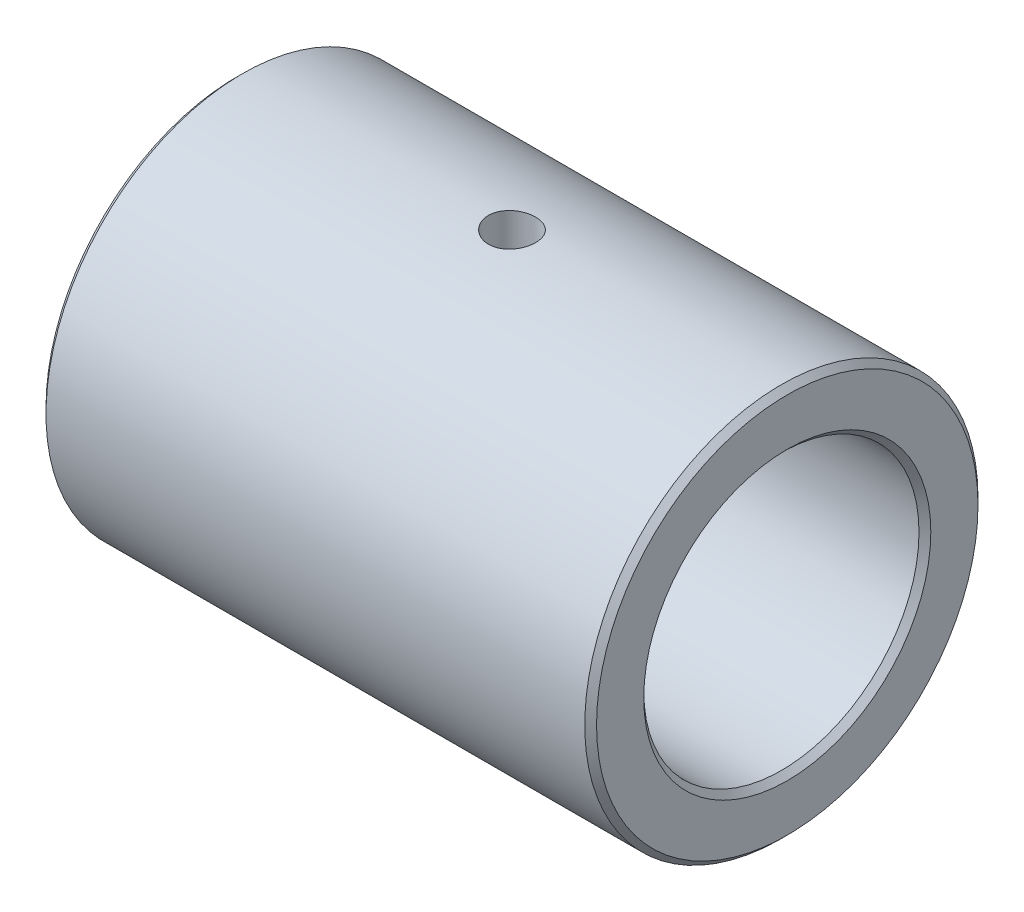
ISO-10303-21;
HEADER;
FILE_DESCRIPTION(('STEP AP214'),'2;1');
FILE_NAME('part.step','',(''),(''),'','','');
FILE_SCHEMA(('AUTOMOTIVE_DESIGN { 1 0 10303 214 1 1 1 1 }'));
ENDSEC;
DATA;
#1=APPLICATION_CONTEXT('core data for automotive mechanical design processes');
#2=APPLICATION_PROTOCOL_DEFINITION('international standard','automotive_design',2000,#1);
#3=PRODUCT_CONTEXT('',#1,'mechanical');
#4=PRODUCT('Part','Part','',(#3));
#5=PRODUCT_RELATED_PRODUCT_CATEGORY('part','',(#4));
#6=PRODUCT_DEFINITION_FORMATION('','',#4);
#7=PRODUCT_DEFINITION_CONTEXT('part definition',#1,'design');
#8=PRODUCT_DEFINITION('design','',#6,#7);
#9=PRODUCT_DEFINITION_SHAPE('','',#8);
#10=(LENGTH_UNIT() NAMED_UNIT(*) SI_UNIT(.MILLI.,.METRE.));
#11=(NAMED_UNIT(*) PLANE_ANGLE_UNIT() SI_UNIT($,.RADIAN.));
#12=(NAMED_UNIT(*) SI_UNIT($,.STERADIAN.) SOLID_ANGLE_UNIT());
#13=UNCERTAINTY_MEASURE_WITH_UNIT(LENGTH_MEASURE(1.E-05),#10,'distance_accuracy_value','');
#14=(GEOMETRIC_REPRESENTATION_CONTEXT(3) GLOBAL_UNCERTAINTY_ASSIGNED_CONTEXT((#13)) GLOBAL_UNIT_ASSIGNED_CONTEXT((#10,
#11,#12)) REPRESENTATION_CONTEXT('',''));
#15=CARTESIAN_POINT('',(0.,0.,0.));
#16=DIRECTION('',(0.,0.,1.));
#17=DIRECTION('',(1.,0.,0.));
#18=AXIS2_PLACEMENT_3D('',#15,#16,#17);
#19=CARTESIAN_POINT('',(70.,0.,0.));
#20=DIRECTION('',(-1.,0.,0.));
#21=DIRECTION('',(0.,0.,1.));
#22=AXIS2_PLACEMENT_3D('',#19,#20,#21);
#23=CYLINDRICAL_SURFACE('',#22,30.5);
#24=CARTESIAN_POINT('',(0.,29.9040131086114,6.00000000000001));
#25=CARTESIAN_POINT('',(-0.166808738876967,29.9040113662041,6.00000325030822));
#26=CARTESIAN_POINT('',(-0.333576561063545,29.9054114389444,5.99304185789445));
#27=CARTESIAN_POINT('',(-0.665957426239095,29.9109664872151,5.96525784579854));
#28=CARTESIAN_POINT('',(-0.8315702654422,29.9151219370705,5.94443283955954));
#29=CARTESIAN_POINT('',(-1.16048273452282,29.9260701895344,5.88906727072663));
#30=CARTESIAN_POINT('',(-1.32378108308997,29.9328643980685,5.85451939639222));
#31=CARTESIAN_POINT('',(-1.64688167712587,29.9488927340983,5.77196600408855));
#32=CARTESIAN_POINT('',(-1.80668261265873,29.9581277594095,5.72395553372198));
#33=CARTESIAN_POINT('',(-2.12139227635536,29.9787538102918,5.6149257036175));
#34=CARTESIAN_POINT('',(-2.27630737578358,29.990141880049,5.55392416436218));
#35=CARTESIAN_POINT('',(-2.58046950358487,30.0147602668044,5.41930317986016));
#36=CARTESIAN_POINT('',(-2.72971441635919,30.0279912629884,5.34567908041723));
#37=CARTESIAN_POINT('',(-3.02140559422439,30.0559115845379,5.18639662331289));
#38=CARTESIAN_POINT('',(-3.16385487959316,30.0706002529373,5.10074367983278));
#39=CARTESIAN_POINT('',(-3.44113356800017,30.1010365237795,4.91794523695948));
#40=CARTESIAN_POINT('',(-3.57596009917906,30.1167845204935,4.82079544822777));
#41=CARTESIAN_POINT('',(-3.83860524444466,30.1490912034409,4.61446950117557));
#42=CARTESIAN_POINT('',(-3.96632126208149,30.1656573114728,4.50516388239712));
#43=CARTESIAN_POINT('',(-4.21216933772349,30.1989656765615,4.27619657672762));
#44=CARTESIAN_POINT('',(-4.33029782648766,30.2157079966219,4.15653106701287));
#45=CARTESIAN_POINT('',(-4.55608373540391,30.248891376206,3.90772480313576));
#46=CARTESIAN_POINT('',(-4.6637442542551,30.2653325237052,3.77858687295307));
#47=CARTESIAN_POINT('',(-4.86792988461421,30.2974680380814,3.51162492881236));
#48=CARTESIAN_POINT('',(-4.96445087786903,30.3131621275211,3.37379773138759));
#49=CARTESIAN_POINT('',(-5.14636359255639,30.3434827571525,3.08928454788025));
#50=CARTESIAN_POINT('',(-5.23165915476718,30.3580996538909,2.94253601594426));
#51=CARTESIAN_POINT('',(-5.38959754755807,30.3857156192404,2.6421668473354));
#52=CARTESIAN_POINT('',(-5.46223563411287,30.3987140807427,2.48854366103637));
#53=CARTESIAN_POINT('',(-5.59424010303606,30.4227102347357,2.1756115995456));
#54=CARTESIAN_POINT('',(-5.65361233258628,30.433708808316,2.0163052653601));
#55=CARTESIAN_POINT('',(-5.75867904114445,30.4534030826835,1.69308897616765));
#56=CARTESIAN_POINT('',(-5.80436854995729,30.4620979465252,1.52917737190533));
#57=CARTESIAN_POINT('',(-5.91926674741273,30.4841239184749,1.03665609662988));
#58=CARTESIAN_POINT('',(-5.96814958484446,30.493742972709,0.702867595080233));
#59=CARTESIAN_POINT('',(-6.00933525491846,30.5018318100581,0.0318819437433463));
#60=CARTESIAN_POINT('',(-6.00164336967909,30.5003026340316,-0.30531488488873));
#61=CARTESIAN_POINT('',(-5.93051894336994,30.4863885077824,-0.968861476961544));
#62=CARTESIAN_POINT('',(-5.86785596642284,30.4741534399723,-1.29529668311896));
#63=CARTESIAN_POINT('',(-5.68976744298893,30.4403658382034,-1.9329135221511));
#64=CARTESIAN_POINT('',(-5.57433983452147,30.4188129401165,-2.24409455838429));
#65=CARTESIAN_POINT('',(-5.29328544551902,30.368564693248,-2.84459141097512));
#66=CARTESIAN_POINT('',(-5.12735544358818,30.3398263939922,-3.13376158565193));
#67=CARTESIAN_POINT('',(-4.75022908385909,30.2783777706433,-3.68043858088027));
#68=CARTESIAN_POINT('',(-4.53902767898689,30.2456670038567,-3.93794186601319));
#69=CARTESIAN_POINT('',(-4.07312603120227,30.1792382983678,-4.4185430019642));
#70=CARTESIAN_POINT('',(-3.81775215064676,30.1455126778446,-4.64098724382798));
#71=CARTESIAN_POINT('',(-3.27298655874615,30.08137978319,-5.03999537960059));
#72=CARTESIAN_POINT('',(-2.98359424519753,30.0509725678202,-5.21655846113099));
#73=CARTESIAN_POINT('',(-2.37808727199693,29.9969052370914,-5.51900727602182));
#74=CARTESIAN_POINT('',(-2.06191990757595,29.973258849803,-5.64479010878876));
#75=CARTESIAN_POINT('',(-1.41236692403906,29.9355941600331,-5.84125929993847));
#76=CARTESIAN_POINT('',(-1.07898347531824,29.9215746470826,-5.91195258535051));
#77=CARTESIAN_POINT('',(-0.4103777670133,29.9049927399895,-5.99526516149311));
#78=CARTESIAN_POINT('',(-0.0752774423085354,29.9022444100394,-6.00882702734425));
#79=CARTESIAN_POINT('',(0.592397913007221,29.9080173648502,-5.98002556245675));
#80=CARTESIAN_POINT('',(0.924973080866907,29.9165380326383,-5.93766529343203));
#81=CARTESIAN_POINT('',(1.57500796111718,29.9437150412556,-5.79903372540418));
#82=CARTESIAN_POINT('',(1.89257883527401,29.9622771278229,-5.70326350700267));
#83=CARTESIAN_POINT('',(2.50716714171061,30.0073632311315,-5.46106519389133));
#84=CARTESIAN_POINT('',(2.80418292576491,30.033887885449,-5.31463304245093));
#85=CARTESIAN_POINT('',(3.37336187301526,30.0923297257445,-4.97312461925423));
#86=CARTESIAN_POINT('',(3.64516356308376,30.1243108182566,-4.77745704523529));
#87=CARTESIAN_POINT('',(4.15241797188043,30.1898855024434,-4.34382149503344));
#88=CARTESIAN_POINT('',(4.38786707254207,30.2234792541857,-4.10584931346147));
#89=CARTESIAN_POINT('',(4.81929283420278,30.2890961367718,-3.59013864004873));
#90=CARTESIAN_POINT('',(5.01463309432466,30.3210886289205,-3.31186328420035));
#91=CARTESIAN_POINT('',(5.35578684227488,30.3793694393942,-2.72588384053148));
#92=CARTESIAN_POINT('',(5.50160236565142,30.4056579921445,-2.41818096289696));
#93=CARTESIAN_POINT('',(5.73863828924959,30.4494404807715,-1.78384152139149));
#94=CARTESIAN_POINT('',(5.83016151219284,30.4669831089648,-1.45732133873613));
#95=CARTESIAN_POINT('',(5.95695718108493,30.4914959331929,-0.79297485469199));
#96=CARTESIAN_POINT('',(5.99223617135943,30.4984673592408,-0.455149873349593));
#97=CARTESIAN_POINT('',(6.00211525080487,30.500418768705,0.0492470025040612));
#98=CARTESIAN_POINT('',(5.99843313304892,30.499690767348,0.215654736046705));
#99=CARTESIAN_POINT('',(5.97727286174661,30.4955347352068,0.547539843534979));
#100=CARTESIAN_POINT('',(5.95979993477707,30.4921077273198,0.713017546029492));
#101=CARTESIAN_POINT('',(5.91118097741924,30.4826426848905,1.04192182534783));
#102=CARTESIAN_POINT('',(5.88003019785638,30.4766037434528,1.20534766944186));
#103=CARTESIAN_POINT('',(5.80431555787926,30.4620862304932,1.52889157895421));
#104=CARTESIAN_POINT('',(5.75975649613875,30.4536085318228,1.68901080590163));
#105=CARTESIAN_POINT('',(5.65765358787501,30.4344629847485,2.00459814126349));
#106=CARTESIAN_POINT('',(5.60013319807623,30.4237990959021,2.16007408422237));
#107=CARTESIAN_POINT('',(5.47251350056018,30.4005669502077,2.46556047663672));
#108=CARTESIAN_POINT('',(5.40241865611935,30.3879993693168,2.61557284272206));
#109=CARTESIAN_POINT('',(5.2501109928163,30.3612918854435,2.90924498989807));
#110=CARTESIAN_POINT('',(5.16789321667638,30.3471513398321,3.05290214084071));
#111=CARTESIAN_POINT('',(4.99196891532706,30.3176885473637,3.33280075401654));
#112=CARTESIAN_POINT('',(4.89826635048113,30.3023667085308,3.46904474929904));
#113=CARTESIAN_POINT('',(4.69839909538455,30.2706964905889,3.7353996639381));
#114=CARTESIAN_POINT('',(4.59205880916464,30.2543355984744,3.86537736505677));
#115=CARTESIAN_POINT('',(4.36892652918177,30.221273189129,4.11589708010313));
#116=CARTESIAN_POINT('',(4.25213822675035,30.2045717937971,4.23644239853742));
#117=CARTESIAN_POINT('',(4.0087949270646,30.1712761635896,4.46740637299889));
#118=CARTESIAN_POINT('',(3.88223413047484,30.1546819987768,4.57781892951738));
#119=CARTESIAN_POINT('',(3.62030665640306,30.1220806735476,4.78764324512899));
#120=CARTESIAN_POINT('',(3.48494323161963,30.1060732996841,4.88705903142165));
#121=CARTESIAN_POINT('',(3.20477606676485,30.0749232207868,5.0752528958233));
#122=CARTESIAN_POINT('',(3.05988642155056,30.0597916727743,5.16390500323988));
#123=CARTESIAN_POINT('',(2.76305497265925,30.0310283123079,5.32863298916815));
#124=CARTESIAN_POINT('',(2.61111579323795,30.0173959480377,5.40471350022331));
#125=CARTESIAN_POINT('',(2.30128898143997,29.9920343162438,5.5437238014707));
#126=CARTESIAN_POINT('',(2.14340510226334,29.9803038719648,5.60666173023299));
#127=CARTESIAN_POINT('',(1.82278439286958,29.9590876758578,5.7189438113554));
#128=CARTESIAN_POINT('',(1.66004851971139,29.949601484605,5.76829062516789));
#129=CARTESIAN_POINT('',(1.25170812746164,29.9292109734439,5.87337174285924));
#130=CARTESIAN_POINT('',(1.00383775629483,29.9198133257082,5.9207931783425));
#131=CARTESIAN_POINT('',(0.503947057560375,29.9072158095058,5.98410434139785));
#132=CARTESIAN_POINT('',(0.251926864790428,29.9040157401234,5.99999509114473));
#133=CARTESIAN_POINT('',(0.,29.9040131086114,6.00000000000001));
#134=B_SPLINE_CURVE_WITH_KNOTS('',3,(#24,#25,#26,#27,#28,#29,#30,#31,#32,#33,#34,#35,#36,#37,
#38,#39,#40,#41,#42,#43,#44,#45,#46,#47,#48,#49,#50,#51,#52,#53,#54,#55,#56,#57,#58,#59,#60,#61,
#62,#63,#64,#65,#66,#67,#68,#69,#70,#71,#72,#73,#74,#75,#76,#77,#78,#79,#80,#81,#82,#83,#84,#85,
#86,#87,#88,#89,#90,#91,#92,#93,#94,#95,#96,#97,#98,#99,#100,#101,#102,#103,#104,#105,#106,#107,
#108,#109,#110,#111,#112,#113,#114,#115,#116,#117,#118,#119,#120,#121,#122,#123,#124,#125,#126,
#127,#128,#129,#130,#131,#132,#133),.UNSPECIFIED.,.T.,.F.,(4,2,2,2,2,2,2,2,2,2,2,2,2,2,2,2,2,2,
2,2,2,2,2,2,2,2,2,2,2,2,2,2,2,2,2,2,2,2,2,2,2,2,2,2,2,2,2,2,2,2,2,2,2,2,4),(0.,
0.500204820511465,1.00049577123816,1.50105364247519,2.00179589278041,2.50185562476711,
3.00210013711823,3.50212020683976,4.00232741984803,4.50849245660276,5.01484507207869,
5.52104733920332,6.02743615251653,6.53791392140115,7.04858260788267,7.55902576132568,
8.06965410698353,9.076767820625,10.0837875059435,11.0769305088524,12.0701123259571,
13.0693790471225,14.0687572293473,15.0849927100123,16.1012461830634,17.1195487684379,
18.1377232904891,19.1390321611507,20.1402862128364,21.1323010145798,22.124395269836,
23.1290259759859,24.1337566057168,25.1533710071583,26.1729434956967,27.1867743648002,
28.2004872604969,28.6993503699146,29.1980245060054,29.6968719270185,30.1955410280464,
30.693314810701,31.190912257926,31.68871374862,32.1863440600847,32.6919464398602,
33.1973708882085,33.7030976127117,34.2086385142106,34.7196189895647,35.2304107503228,
35.7408852580623,36.2512597319847,37.0067304491631,37.7621766747799),.UNSPECIFIED.);
#135=CARTESIAN_POINT('',(0.,29.9040131086114,6.00000000000001));
#136=VERTEX_POINT('',#135);
#137=EDGE_CURVE('E88',#136,#136,#134,.T.);
#138=ORIENTED_EDGE('',*,*,#137,.F.);
#139=EDGE_LOOP('',(#138));
#140=FACE_BOUND('',#139,.T.);
#141=CARTESIAN_POINT('',(-9.00000000000001,0.,0.));
#142=DIRECTION('',(-1.,0.,0.));
#143=DIRECTION('',(0.,0.,1.));
#144=AXIS2_PLACEMENT_3D('',#141,#142,#143);
#145=CIRCLE('',#144,30.5);
#146=CARTESIAN_POINT('',(-9.00000000000001,0.,30.5));
#147=VERTEX_POINT('',#146);
#148=EDGE_CURVE('E76',#147,#147,#145,.T.);
#149=ORIENTED_EDGE('',*,*,#148,.T.);
#150=EDGE_LOOP('',(#149));
#151=FACE_BOUND('',#150,.T.);
#152=CARTESIAN_POINT('',(9.00000000000001,0.,0.));
#153=DIRECTION('',(1.,0.,0.));
#154=DIRECTION('',(0.,0.,-1.));
#155=AXIS2_PLACEMENT_3D('',#152,#153,#154);
#156=CIRCLE('',#155,30.5);
#157=CARTESIAN_POINT('',(9.00000000000001,0.,-30.5));
#158=VERTEX_POINT('',#157);
#159=EDGE_CURVE('E77',#158,#158,#156,.T.);
#160=ORIENTED_EDGE('',*,*,#159,.T.);
#161=EDGE_LOOP('',(#160));
#162=FACE_BOUND('',#161,.T.);
#163=ADVANCED_FACE('F36',(#140,#151,#162),#23,.F.);
#164=CARTESIAN_POINT('',(70.,0.,0.));
#165=DIRECTION('',(1.,0.,0.));
#166=DIRECTION('',(0.,0.,-1.));
#167=AXIS2_PLACEMENT_3D('',#164,#165,#166);
#168=PLANE('',#167);
#169=CARTESIAN_POINT('',(70.,0.,0.));
#170=DIRECTION('',(1.,0.,0.));
#171=DIRECTION('',(0.,0.,-1.));
#172=AXIS2_PLACEMENT_3D('',#169,#170,#171);
#173=CIRCLE('',#172,36.5000000000002);
#174=CARTESIAN_POINT('',(70.,0.,-36.5000000000002));
#175=VERTEX_POINT('',#174);
#176=EDGE_CURVE('E67',#175,#175,#173,.F.);
#177=ORIENTED_EDGE('',*,*,#176,.T.);
#178=EDGE_LOOP('',(#177));
#179=FACE_BOUND('',#178,.T.);
#180=CARTESIAN_POINT('',(70.,0.,0.));
#181=DIRECTION('',(1.,0.,0.));
#182=DIRECTION('',(0.,0.,-1.));
#183=AXIS2_PLACEMENT_3D('',#180,#181,#182);
#184=CIRCLE('',#183,48.5);
#185=CARTESIAN_POINT('',(70.,0.,-48.5));
#186=VERTEX_POINT('',#185);
#187=EDGE_CURVE('E70',#186,#186,#184,.T.);
#188=ORIENTED_EDGE('',*,*,#187,.T.);
#189=EDGE_LOOP('',(#188));
#190=FACE_BOUND('',#189,.T.);
#191=ADVANCED_FACE('F125',(#179,#190),#168,.T.);
#192=CARTESIAN_POINT('',(-70.,0.,0.));
#193=DIRECTION('',(1.,0.,0.));
#194=DIRECTION('',(0.,0.,-1.));
#195=AXIS2_PLACEMENT_3D('',#192,#193,#194);
#196=PLANE('',#195);
#197=CARTESIAN_POINT('',(-70.,0.,0.));
#198=DIRECTION('',(1.,0.,0.));
#199=DIRECTION('',(0.,0.,-1.));
#200=AXIS2_PLACEMENT_3D('',#197,#198,#199);
#201=CIRCLE('',#200,36.5000000000002);
#202=CARTESIAN_POINT('',(-70.,0.,-36.5000000000002));
#203=VERTEX_POINT('',#202);
#204=EDGE_CURVE('E56',#203,#203,#201,.T.);
#205=ORIENTED_EDGE('',*,*,#204,.T.);
#206=EDGE_LOOP('',(#205));
#207=FACE_BOUND('',#206,.T.);
#208=CARTESIAN_POINT('',(-70.,0.,0.));
#209=DIRECTION('',(1.,0.,0.));
#210=DIRECTION('',(0.,0.,-1.));
#211=AXIS2_PLACEMENT_3D('',#208,#209,#210);
#212=CIRCLE('',#211,48.5);
#213=CARTESIAN_POINT('',(-70.,0.,-48.5));
#214=VERTEX_POINT('',#213);
#215=EDGE_CURVE('E61',#214,#214,#212,.F.);
#216=ORIENTED_EDGE('',*,*,#215,.T.);
#217=EDGE_LOOP('',(#216));
#218=FACE_BOUND('',#217,.T.);
#219=ADVANCED_FACE('F122',(#207,#218),#196,.F.);
#220=CARTESIAN_POINT('',(70.,0.,0.));
#221=DIRECTION('',(-1.,0.,0.));
#222=DIRECTION('',(0.,0.,1.));
#223=AXIS2_PLACEMENT_3D('',#220,#221,#222);
#224=CYLINDRICAL_SURFACE('',#223,50.);
#225=CARTESIAN_POINT('',(0.,49.6386945839634,6.00000000000001));
#226=CARTESIAN_POINT('',(-0.167918124886778,49.6386939657955,6.00000186628719));
#227=CARTESIAN_POINT('',(-0.33580863327865,49.6395483638708,5.99294832465342));
#228=CARTESIAN_POINT('',(-0.670443147760512,49.6429402363712,5.96478797240338));
#229=CARTESIAN_POINT('',(-0.837186881749448,49.6454780972043,5.94367793537245));
#230=CARTESIAN_POINT('',(-1.16840651253325,49.6521674178577,5.88753481561084));
#231=CARTESIAN_POINT('',(-1.33288059577218,49.6563200985169,5.85249119833758));
#232=CARTESIAN_POINT('',(-1.65832717709064,49.6661210914794,5.76872543601141));
#233=CARTESIAN_POINT('',(-1.81929836926599,49.6717699515719,5.71999828067339));
#234=CARTESIAN_POINT('',(-2.13637238140056,49.6843940799991,5.60928540988836));
#235=CARTESIAN_POINT('',(-2.29248007679114,49.6913679667642,5.54731349606452));
#236=CARTESIAN_POINT('',(-2.59896417039107,49.7064500516452,5.41050440626143));
#237=CARTESIAN_POINT('',(-2.74933843274764,49.7145586673238,5.33566249199041));
#238=CARTESIAN_POINT('',(-3.04316513024362,49.7316735264637,5.173709633931));
#239=CARTESIAN_POINT('',(-3.18662134479042,49.7406792713762,5.08660549345671));
#240=CARTESIAN_POINT('',(-3.46575883490178,49.759341643455,4.9006783189144));
#241=CARTESIAN_POINT('',(-3.60143720553927,49.7689985109146,4.80185094812155));
#242=CARTESIAN_POINT('',(-3.86458188402161,49.7887306752385,4.592751728969));
#243=CARTESIAN_POINT('',(-3.99201086786619,49.7988075749965,4.48243305830745));
#244=CARTESIAN_POINT('',(-4.2371813233906,49.8190603208647,4.25143182977891));
#245=CARTESIAN_POINT('',(-4.35491919520058,49.8292362021872,4.13074545443097));
#246=CARTESIAN_POINT('',(-4.57979598439474,49.8493930792684,3.87992646885599));
#247=CARTESIAN_POINT('',(-4.68693826974766,49.85937413614,3.74979688324862));
#248=CARTESIAN_POINT('',(-4.8899509656293,49.8788673132848,3.48091487822483));
#249=CARTESIAN_POINT('',(-4.98581720344603,49.8883792592117,3.34215929560157));
#250=CARTESIAN_POINT('',(-5.16579334697846,49.906686734482,3.05665336196253));
#251=CARTESIAN_POINT('',(-5.24987103688582,49.9154802742414,2.90988256957656));
#252=CARTESIAN_POINT('',(-5.40538729620952,49.9320761813106,2.60967084194707));
#253=CARTESIAN_POINT('',(-5.47682116566923,49.9398781797423,2.45622745265913));
#254=CARTESIAN_POINT('',(-5.60646531063593,49.9542619844842,2.14385525327358));
#255=CARTESIAN_POINT('',(-5.66468082215968,49.9608442737511,1.9849286440111));
#256=CARTESIAN_POINT('',(-5.76751244477467,49.9726087983912,1.66266743351627));
#257=CARTESIAN_POINT('',(-5.81212355808138,49.9777905191648,1.49933123628255));
#258=CARTESIAN_POINT('',(-5.92458067111047,49.990947305116,1.00616605851105));
#259=CARTESIAN_POINT('',(-5.97182420394155,49.9966227510868,0.671309935151468));
#260=CARTESIAN_POINT('',(-6.00946430094797,50.001133594916,-0.00143998454426491));
#261=CARTESIAN_POINT('',(-5.99986293593298,49.9999692419423,-0.339333669776962));
#262=CARTESIAN_POINT('',(-5.92437720819325,49.9909678612596,-1.0069577746982));
#263=CARTESIAN_POINT('',(-5.85878257128195,49.9831651829098,-1.33672124131977));
#264=CARTESIAN_POINT('',(-5.6736049153629,49.9617994784374,-1.9805123740634));
#265=CARTESIAN_POINT('',(-5.55402093859413,49.9482363501257,-2.29453976092047));
#266=CARTESIAN_POINT('',(-5.26395421441513,49.9168155287485,-2.89886126925535));
#267=CARTESIAN_POINT('',(-5.09334544014085,49.8989472237584,-3.18909433263432));
#268=CARTESIAN_POINT('',(-4.7061622899378,49.8609162074128,-3.73691810232495));
#269=CARTESIAN_POINT('',(-4.48958597077692,49.8407533990761,-3.99450742791968));
#270=CARTESIAN_POINT('',(-4.01499127716215,49.8002413452786,-4.4714343516315));
#271=CARTESIAN_POINT('',(-3.75672043088653,49.7798917254956,-4.69052075859545));
#272=CARTESIAN_POINT('',(-3.20693697900733,49.7414252102277,-5.0822718554754));
#273=CARTESIAN_POINT('',(-2.91542428337968,49.7233083207897,-5.25493641966964));
#274=CARTESIAN_POINT('',(-2.30721501799596,49.6913584107723,-5.54895356211259));
#275=CARTESIAN_POINT('',(-1.99050911701688,49.6775269868435,-5.67028702189265));
#276=CARTESIAN_POINT('',(-1.3410152814648,49.6557456613921,-5.85798020190769));
#277=CARTESIAN_POINT('',(-1.00822805992111,49.6477954993547,-5.92434235715149));
#278=CARTESIAN_POINT('',(-0.338233807087879,49.638724003119,-5.9998785742628));
#279=CARTESIAN_POINT('',(-0.00106712806613896,49.6375605121624,-6.00940568673752));
#280=CARTESIAN_POINT('',(0.670057561514332,49.6420826601936,-5.97193195978998));
#281=CARTESIAN_POINT('',(1.00401563484725,49.6477681649094,-5.92493222855626));
#282=CARTESIAN_POINT('',(1.65819156772185,49.6653092551459,-5.77603584409268));
#283=CARTESIAN_POINT('',(1.97844869554845,49.6771457209962,-5.67430926964187));
#284=CARTESIAN_POINT('',(2.5973585640221,49.7056395700851,-5.41902151618869));
#285=CARTESIAN_POINT('',(2.89601060181251,49.7222971100749,-5.26545865176853));
#286=CARTESIAN_POINT('',(3.46483259717789,49.758657464778,-4.90998612819356));
#287=CARTESIAN_POINT('',(3.734856600799,49.7783747298946,-4.70784441873855));
#288=CARTESIAN_POINT('',(4.23727019898628,49.81858710015,-4.26128008081517));
#289=CARTESIAN_POINT('',(4.46965844588966,49.8390822331105,-4.01685593894352));
#290=CARTESIAN_POINT('',(4.89143959592112,49.8786702187142,-3.49112958066052));
#291=CARTESIAN_POINT('',(5.08060087256871,49.8977551624393,-3.20964087216534));
#292=CARTESIAN_POINT('',(5.40895603911928,49.9322543750009,-2.61866898556457));
#293=CARTESIAN_POINT('',(5.54815086805532,49.9476687128184,-2.30918633369363));
#294=CARTESIAN_POINT('',(5.77224342289579,49.9730565002518,-1.67185291081449));
#295=CARTESIAN_POINT('',(5.85727630762507,49.9830434843718,-1.34405010065744));
#296=CARTESIAN_POINT('',(5.97104821952566,49.9965007291191,-0.678507412845251));
#297=CARTESIAN_POINT('',(5.99978957629508,49.9999712594265,-0.340767947001054));
#298=CARTESIAN_POINT('',(6.00010325159948,50.0000141259678,0.164459024999296));
#299=CARTESIAN_POINT('',(5.99314859169878,49.9991768300729,0.332199152004167));
#300=CARTESIAN_POINT('',(5.96522294902389,49.995836295283,0.66647503511321));
#301=CARTESIAN_POINT('',(5.94425718305907,49.9933336764457,0.833011216167456));
#302=CARTESIAN_POINT('',(5.88844780738534,49.986728873073,1.16375933259519));
#303=CARTESIAN_POINT('',(5.85359914923476,49.9826261066637,1.32797039993355));
#304=CARTESIAN_POINT('',(5.77029912163392,49.972939076134,1.65279946636273));
#305=CARTESIAN_POINT('',(5.72185270714303,49.9673553517085,1.81341875130679));
#306=CARTESIAN_POINT('',(5.61170104216522,49.954861600223,2.13000100974509));
#307=CARTESIAN_POINT('',(5.54999498360142,49.9479514923324,2.28596369879432));
#308=CARTESIAN_POINT('',(5.41379613986185,49.933001225375,2.59207732245001));
#309=CARTESIAN_POINT('',(5.33930800390738,49.9249614773837,2.74223034595406));
#310=CARTESIAN_POINT('',(5.17803109154706,49.907971073449,3.03579512604825));
#311=CARTESIAN_POINT('',(5.09123784839542,49.8990200870607,3.17920440938013));
#312=CARTESIAN_POINT('',(4.90601717787916,49.8804623131687,3.45818151755163));
#313=CARTESIAN_POINT('',(4.80759394608486,49.8708557626879,3.59375214409447));
#314=CARTESIAN_POINT('',(4.59910845507023,49.8511881878563,3.85701634533238));
#315=CARTESIAN_POINT('',(4.48897563985419,49.8411246452392,3.98465386348062));
#316=CARTESIAN_POINT('',(4.25841136948732,49.8208880751955,4.23016326852784));
#317=CARTESIAN_POINT('',(4.13798366781236,49.8107150888442,4.34803868405188));
#318=CARTESIAN_POINT('',(3.88755920580317,49.7905366022016,4.57332116710604));
#319=CARTESIAN_POINT('',(3.75755669522543,49.7805312070591,4.6807218524621));
#320=CARTESIAN_POINT('',(3.48900343987637,49.760980906172,4.88418098092105));
#321=CARTESIAN_POINT('',(3.35045586947184,49.7514358317449,4.98024359777173));
#322=CARTESIAN_POINT('',(3.06517256422475,49.7330367653586,5.1607480813597));
#323=CARTESIAN_POINT('',(2.91840667290158,49.7241856493923,5.24514259108262));
#324=CARTESIAN_POINT('',(2.61828118563308,49.7074738582385,5.40122240172562));
#325=CARTESIAN_POINT('',(2.46492403363588,49.6996128201215,5.47291236365596));
#326=CARTESIAN_POINT('',(2.15277197726514,49.6851099315096,5.6030473498545));
#327=CARTESIAN_POINT('',(1.99398148000064,49.6784671194541,5.66150282888506));
#328=CARTESIAN_POINT('',(1.67203649687076,49.6665865461182,5.76479631782693));
#329=CARTESIAN_POINT('',(1.50888306031421,49.6613484502801,5.80963757054259));
#330=CARTESIAN_POINT('',(1.12397204266617,49.6509312967492,5.89810685359551));
#331=CARTESIAN_POINT('',(0.900921430416405,49.6463619334536,5.93627800266979));
#332=CARTESIAN_POINT('',(0.451897201713403,49.6402440031507,5.98722323432348));
#333=CARTESIAN_POINT('',(0.225923605080449,49.6386954156707,5.99999748902432));
#334=CARTESIAN_POINT('',(0.,49.6386945839634,6.00000000000001));
#335=B_SPLINE_CURVE_WITH_KNOTS('',3,(#225,#226,#227,#228,#229,#230,#231,#232,#233,#234,#235,
#236,#237,#238,#239,#240,#241,#242,#243,#244,#245,#246,#247,#248,#249,#250,#251,#252,#253,#254,
#255,#256,#257,#258,#259,#260,#261,#262,#263,#264,#265,#266,#267,#268,#269,#270,#271,#272,#273,
#274,#275,#276,#277,#278,#279,#280,#281,#282,#283,#284,#285,#286,#287,#288,#289,#290,#291,#292,
#293,#294,#295,#296,#297,#298,#299,#300,#301,#302,#303,#304,#305,#306,#307,#308,#309,#310,#311,
#312,#313,#314,#315,#316,#317,#318,#319,#320,#321,#322,#323,#324,#325,#326,#327,#328,#329,#330,
#331,#332,#333,#334),.UNSPECIFIED.,.T.,.F.,(4,2,2,2,2,2,2,2,2,2,2,2,2,2,2,2,2,2,2,2,2,2,2,2,2,2,
2,2,2,2,2,2,2,2,2,2,2,2,2,2,2,2,2,2,2,2,2,2,2,2,2,2,2,2,4),(0.,0.503556672239868,
1.00722896668099,1.51128279101929,2.01552141797546,2.51923714582748,3.0231387231008,
3.52676182012282,4.0305718047172,4.53652147771801,5.04265825099476,5.5486336203424,
6.05479564118059,6.56231501315845,7.07002264567005,7.57752881431943,8.08522119917648,
9.09460487004069,10.1039517701711,11.1081074488923,12.1122809418519,13.1189554328239,
14.1256724884352,15.1387314138955,16.1517930829411,17.1652317392504,18.1786255018819,
19.1857176074446,20.1927899696486,21.1967505050428,22.2007436865997,23.209631531931,
24.2185554955773,25.232765111624,26.2469556663551,27.2586053325379,28.2702131311954,
28.7733824157873,29.2763644577143,29.7795295736543,30.2825115760687,30.7855242401999,
31.2883543299977,31.7913674163633,32.2941995893665,32.8002546187697,33.3061259230148,
33.8123035501008,34.3182942590324,34.8262818423935,35.334082669062,35.8414809408116,
36.3487582591936,37.0262676695499,37.7037724882314),.UNSPECIFIED.);
#336=CARTESIAN_POINT('',(0.,49.6386945839634,6.00000000000001));
#337=VERTEX_POINT('',#336);
#338=EDGE_CURVE('E10',#337,#337,#335,.T.);
#339=ORIENTED_EDGE('',*,*,#338,.T.);
#340=EDGE_LOOP('',(#339));
#341=FACE_BOUND('',#340,.T.);
#342=CARTESIAN_POINT('',(68.5,0.,-2.22044604925031E-13));
#343=DIRECTION('',(1.,0.,0.));
#344=DIRECTION('',(0.,0.,-1.));
#345=AXIS2_PLACEMENT_3D('',#342,#343,#344);
#346=CIRCLE('',#345,50.);
#347=CARTESIAN_POINT('',(68.5,0.,-50.0000000000002));
#348=VERTEX_POINT('',#347);
#349=EDGE_CURVE('E48',#348,#348,#346,.F.);
#350=ORIENTED_EDGE('',*,*,#349,.T.);
#351=EDGE_LOOP('',(#350));
#352=FACE_BOUND('',#351,.T.);
#353=CARTESIAN_POINT('',(-68.4999999999999,0.,0.));
#354=DIRECTION('',(1.,0.,0.));
#355=DIRECTION('',(0.,0.,-1.));
#356=AXIS2_PLACEMENT_3D('',#353,#354,#355);
#357=CIRCLE('',#356,50.);
#358=CARTESIAN_POINT('',(-68.4999999999999,0.,-50.));
#359=VERTEX_POINT('',#358);
#360=EDGE_CURVE('E52',#359,#359,#357,.T.);
#361=ORIENTED_EDGE('',*,*,#360,.T.);
#362=EDGE_LOOP('',(#361));
#363=FACE_BOUND('',#362,.T.);
#364=ADVANCED_FACE('F117',(#341,#352,#363),#224,.T.);
#365=CARTESIAN_POINT('',(-9.00000000000001,0.,0.));
#366=DIRECTION('',(-1.,0.,0.));
#367=DIRECTION('',(0.,0.,1.));
#368=AXIS2_PLACEMENT_3D('',#365,#366,#367);
#369=CYLINDRICAL_SURFACE('',#368,35.);
#370=CARTESIAN_POINT('',(-68.4999999999998,0.,0.));
#371=DIRECTION('',(1.,0.,0.));
#372=DIRECTION('',(0.,0.,-1.));
#373=AXIS2_PLACEMENT_3D('',#370,#371,#372);
#374=CIRCLE('',#373,35.);
#375=CARTESIAN_POINT('',(-68.4999999999998,0.,35.));
#376=VERTEX_POINT('',#375);
#377=EDGE_CURVE('E64',#376,#376,#374,.F.);
#378=CARTESIAN_POINT('',(-9.00000000000001,0.,0.));
#379=DIRECTION('',(-1.,0.,0.));
#380=DIRECTION('',(0.,0.,1.));
#381=AXIS2_PLACEMENT_3D('',#378,#379,#380);
#382=CIRCLE('',#381,35.);
#383=CARTESIAN_POINT('',(-9.00000000000001,0.,35.));
#384=VERTEX_POINT('',#383);
#385=EDGE_CURVE('E80',#384,#384,#382,.T.);
#386=CARTESIAN_POINT('',(-68.4999999999998,0.,35.));
#387=CARTESIAN_POINT('',(-67.8802083333332,0.,35.));
#388=CARTESIAN_POINT('',(-67.2604166666665,0.,35.));
#389=CARTESIAN_POINT('',(-66.0208333333332,0.,35.));
#390=CARTESIAN_POINT('',(-65.4010416666665,0.,35.));
#391=CARTESIAN_POINT('',(-64.1614583333332,0.,35.));
#392=CARTESIAN_POINT('',(-63.5416666666665,0.,35.));
#393=CARTESIAN_POINT('',(-62.3020833333332,0.,35.));
#394=CARTESIAN_POINT('',(-61.6822916666665,0.,35.));
#395=CARTESIAN_POINT('',(-60.4427083333332,0.,35.));
#396=CARTESIAN_POINT('',(-59.8229166666665,0.,35.));
#397=CARTESIAN_POINT('',(-58.5833333333332,0.,35.));
#398=CARTESIAN_POINT('',(-57.9635416666665,0.,35.));
#399=CARTESIAN_POINT('',(-56.7239583333332,0.,35.));
#400=CARTESIAN_POINT('',(-56.1041666666665,0.,35.));
#401=CARTESIAN_POINT('',(-54.8645833333332,0.,35.));
#402=CARTESIAN_POINT('',(-54.2447916666666,0.,35.));
#403=CARTESIAN_POINT('',(-53.0052083333332,0.,35.));
#404=CARTESIAN_POINT('',(-52.3854166666666,0.,35.));
#405=CARTESIAN_POINT('',(-51.1458333333332,0.,35.));
#406=CARTESIAN_POINT('',(-50.5260416666666,0.,35.));
#407=CARTESIAN_POINT('',(-49.2864583333332,0.,35.));
#408=CARTESIAN_POINT('',(-48.6666666666666,0.,35.));
#409=CARTESIAN_POINT('',(-47.4270833333332,0.,35.));
#410=CARTESIAN_POINT('',(-46.8072916666666,0.,35.));
#411=CARTESIAN_POINT('',(-45.5677083333332,0.,35.));
#412=CARTESIAN_POINT('',(-44.9479166666666,0.,35.));
#413=CARTESIAN_POINT('',(-43.7083333333332,0.,35.));
#414=CARTESIAN_POINT('',(-43.0885416666666,0.,35.));
#415=CARTESIAN_POINT('',(-41.8489583333333,0.,35.));
#416=CARTESIAN_POINT('',(-41.2291666666666,0.,35.));
#417=CARTESIAN_POINT('',(-39.9895833333333,0.,35.));
#418=CARTESIAN_POINT('',(-39.3697916666666,0.,35.));
#419=CARTESIAN_POINT('',(-38.1302083333333,0.,35.));
#420=CARTESIAN_POINT('',(-37.5104166666666,0.,35.));
#421=CARTESIAN_POINT('',(-36.2708333333333,0.,35.));
#422=CARTESIAN_POINT('',(-35.6510416666666,0.,35.));
#423=CARTESIAN_POINT('',(-34.4114583333333,0.,35.));
#424=CARTESIAN_POINT('',(-33.7916666666666,0.,35.));
#425=CARTESIAN_POINT('',(-32.5520833333333,0.,35.));
#426=CARTESIAN_POINT('',(-31.9322916666666,0.,35.));
#427=CARTESIAN_POINT('',(-30.6927083333333,0.,35.));
#428=CARTESIAN_POINT('',(-30.0729166666666,0.,35.));
#429=CARTESIAN_POINT('',(-28.8333333333333,0.,35.));
#430=CARTESIAN_POINT('',(-28.2135416666666,0.,35.));
#431=CARTESIAN_POINT('',(-26.9739583333333,0.,35.));
#432=CARTESIAN_POINT('',(-26.3541666666666,0.,35.));
#433=CARTESIAN_POINT('',(-25.1145833333333,0.,35.));
#434=CARTESIAN_POINT('',(-24.4947916666666,0.,35.));
#435=CARTESIAN_POINT('',(-23.2552083333333,0.,35.));
#436=CARTESIAN_POINT('',(-22.6354166666666,0.,35.));
#437=CARTESIAN_POINT('',(-21.3958333333333,0.,35.));
#438=CARTESIAN_POINT('',(-20.7760416666666,0.,35.));
#439=CARTESIAN_POINT('',(-19.5364583333333,0.,35.));
#440=CARTESIAN_POINT('',(-18.9166666666666,0.,35.));
#441=CARTESIAN_POINT('',(-17.6770833333333,0.,35.));
#442=CARTESIAN_POINT('',(-17.0572916666667,0.,35.));
#443=CARTESIAN_POINT('',(-15.8177083333333,0.,35.));
#444=CARTESIAN_POINT('',(-15.1979166666667,0.,35.));
#445=CARTESIAN_POINT('',(-13.9583333333333,0.,35.));
#446=CARTESIAN_POINT('',(-13.3385416666667,0.,35.));
#447=CARTESIAN_POINT('',(-12.0989583333333,0.,35.));
#448=CARTESIAN_POINT('',(-11.4791666666667,0.,35.));
#449=CARTESIAN_POINT('',(-10.2395833333333,0.,35.));
#450=CARTESIAN_POINT('',(-9.61979166666667,0.,35.));
#451=CARTESIAN_POINT('',(-9.00000000000001,0.,35.));
#452=B_SPLINE_CURVE_WITH_KNOTS('',3,(#386,#387,#388,#389,#390,#391,#392,#393,#394,#395,#396,
#397,#398,#399,#400,#401,#402,#403,#404,#405,#406,#407,#408,#409,#410,#411,#412,#413,#414,#415,
#416,#417,#418,#419,#420,#421,#422,#423,#424,#425,#426,#427,#428,#429,#430,#431,#432,#433,#434,
#435,#436,#437,#438,#439,#440,#441,#442,#443,#444,#445,#446,#447,#448,#449,#450,#451),
.UNSPECIFIED.,.F.,.F.,(4,2,2,2,2,2,2,2,2,2,2,2,2,2,2,2,2,2,2,2,2,2,2,2,2,2,2,2,2,2,2,2,4),(0.,
1.859375,3.71874999999999,5.57812499999999,7.43749999999997,9.29687499999997,11.15625,13.015625,
14.875,16.7343749999999,18.5937499999999,20.4531249999999,22.3124999999999,24.1718749999999,
26.0312499999999,27.8906249999999,29.7499999999999,31.6093749999999,33.4687499999999,
35.3281249999999,37.1874999999999,39.0468749999999,40.9062499999999,42.7656249999999,
44.6249999999999,46.4843749999999,48.3437499999999,50.2031249999999,52.0624999999999,
53.9218749999999,55.7812499999998,57.6406249999998,59.4999999999998),.UNSPECIFIED.);
#453=EDGE_CURVE('BSEAM114',#376,#384,#452,.T.);
#454=ORIENTED_EDGE('',*,*,#377,.T.);
#455=ORIENTED_EDGE('',*,*,#385,.F.);
#456=ORIENTED_EDGE('',*,*,#453,.T.);
#457=ORIENTED_EDGE('',*,*,#453,.F.);
#458=EDGE_LOOP('',(#454,#456,#455,#457));
#459=FACE_BOUND('',#458,.T.);
#460=ADVANCED_FACE('F114',(#459),#369,.F.);
#461=CARTESIAN_POINT('',(-9.00000000000001,0.,0.));
#462=DIRECTION('',(-1.,0.,0.));
#463=DIRECTION('',(0.,0.,1.));
#464=AXIS2_PLACEMENT_3D('',#461,#462,#463);
#465=PLANE('',#464);
#466=ORIENTED_EDGE('',*,*,#148,.F.);
#467=EDGE_LOOP('',(#466));
#468=FACE_BOUND('',#467,.T.);
#469=ORIENTED_EDGE('',*,*,#385,.T.);
#470=EDGE_LOOP('',(#469));
#471=FACE_BOUND('',#470,.T.);
#472=ADVANCED_FACE('F111',(#468,#471),#465,.T.);
#473=CARTESIAN_POINT('',(9.00000000000001,0.,0.));
#474=DIRECTION('',(1.,0.,0.));
#475=DIRECTION('',(0.,0.,-1.));
#476=AXIS2_PLACEMENT_3D('',#473,#474,#475);
#477=CYLINDRICAL_SURFACE('',#476,35.);
#478=CARTESIAN_POINT('',(68.4999999999998,0.,-2.22044604925031E-13));
#479=DIRECTION('',(1.,0.,0.));
#480=DIRECTION('',(0.,0.,-1.));
#481=AXIS2_PLACEMENT_3D('',#478,#479,#480);
#482=CIRCLE('',#481,35.);
#483=CARTESIAN_POINT('',(68.4999999999998,0.,-35.));
#484=VERTEX_POINT('',#483);
#485=EDGE_CURVE('E73',#484,#484,#482,.T.);
#486=CARTESIAN_POINT('',(9.00000000000001,0.,0.));
#487=DIRECTION('',(1.,0.,0.));
#488=DIRECTION('',(0.,0.,-1.));
#489=AXIS2_PLACEMENT_3D('',#486,#487,#488);
#490=CIRCLE('',#489,35.);
#491=CARTESIAN_POINT('',(9.00000000000001,0.,-35.));
#492=VERTEX_POINT('',#491);
#493=EDGE_CURVE('E81',#492,#492,#490,.T.);
#494=CARTESIAN_POINT('',(68.4999999999998,0.,-35.));
#495=CARTESIAN_POINT('',(67.8802083333332,0.,-35.));
#496=CARTESIAN_POINT('',(67.2604166666665,0.,-35.));
#497=CARTESIAN_POINT('',(66.0208333333332,0.,-35.));
#498=CARTESIAN_POINT('',(65.4010416666665,0.,-35.));
#499=CARTESIAN_POINT('',(64.1614583333332,0.,-35.));
#500=CARTESIAN_POINT('',(63.5416666666665,0.,-35.));
#501=CARTESIAN_POINT('',(62.3020833333332,0.,-35.));
#502=CARTESIAN_POINT('',(61.6822916666665,0.,-35.));
#503=CARTESIAN_POINT('',(60.4427083333332,0.,-35.));
#504=CARTESIAN_POINT('',(59.8229166666665,0.,-35.));
#505=CARTESIAN_POINT('',(58.5833333333332,0.,-35.));
#506=CARTESIAN_POINT('',(57.9635416666665,0.,-35.));
#507=CARTESIAN_POINT('',(56.7239583333332,0.,-35.));
#508=CARTESIAN_POINT('',(56.1041666666665,0.,-35.));
#509=CARTESIAN_POINT('',(54.8645833333332,0.,-35.));
#510=CARTESIAN_POINT('',(54.2447916666665,0.,-35.));
#511=CARTESIAN_POINT('',(53.0052083333332,0.,-35.));
#512=CARTESIAN_POINT('',(52.3854166666665,0.,-35.));
#513=CARTESIAN_POINT('',(51.1458333333332,0.,-35.));
#514=CARTESIAN_POINT('',(50.5260416666666,0.,-35.));
#515=CARTESIAN_POINT('',(49.2864583333332,0.,-35.));
#516=CARTESIAN_POINT('',(48.6666666666666,0.,-35.));
#517=CARTESIAN_POINT('',(47.4270833333332,0.,-35.));
#518=CARTESIAN_POINT('',(46.8072916666666,0.,-35.));
#519=CARTESIAN_POINT('',(45.5677083333332,0.,-35.));
#520=CARTESIAN_POINT('',(44.9479166666666,0.,-35.));
#521=CARTESIAN_POINT('',(43.7083333333332,0.,-35.));
#522=CARTESIAN_POINT('',(43.0885416666666,0.,-35.));
#523=CARTESIAN_POINT('',(41.8489583333332,0.,-35.));
#524=CARTESIAN_POINT('',(41.2291666666666,0.,-35.));
#525=CARTESIAN_POINT('',(39.9895833333333,0.,-35.));
#526=CARTESIAN_POINT('',(39.3697916666666,0.,-35.));
#527=CARTESIAN_POINT('',(38.1302083333333,0.,-35.));
#528=CARTESIAN_POINT('',(37.5104166666666,0.,-35.));
#529=CARTESIAN_POINT('',(36.2708333333333,0.,-35.));
#530=CARTESIAN_POINT('',(35.6510416666666,0.,-35.));
#531=CARTESIAN_POINT('',(34.4114583333333,0.,-35.));
#532=CARTESIAN_POINT('',(33.7916666666666,0.,-35.));
#533=CARTESIAN_POINT('',(32.5520833333333,0.,-35.));
#534=CARTESIAN_POINT('',(31.9322916666666,0.,-35.));
#535=CARTESIAN_POINT('',(30.6927083333333,0.,-35.));
#536=CARTESIAN_POINT('',(30.0729166666666,0.,-35.));
#537=CARTESIAN_POINT('',(28.8333333333333,0.,-35.));
#538=CARTESIAN_POINT('',(28.2135416666666,0.,-35.));
#539=CARTESIAN_POINT('',(26.9739583333333,0.,-35.));
#540=CARTESIAN_POINT('',(26.3541666666666,0.,-35.));
#541=CARTESIAN_POINT('',(25.1145833333333,0.,-35.));
#542=CARTESIAN_POINT('',(24.4947916666666,0.,-35.));
#543=CARTESIAN_POINT('',(23.2552083333333,0.,-35.));
#544=CARTESIAN_POINT('',(22.6354166666666,0.,-35.));
#545=CARTESIAN_POINT('',(21.3958333333333,0.,-35.));
#546=CARTESIAN_POINT('',(20.7760416666666,0.,-35.));
#547=CARTESIAN_POINT('',(19.5364583333333,0.,-35.));
#548=CARTESIAN_POINT('',(18.9166666666666,0.,-35.));
#549=CARTESIAN_POINT('',(17.6770833333333,0.,-35.));
#550=CARTESIAN_POINT('',(17.0572916666667,0.,-35.));
#551=CARTESIAN_POINT('',(15.8177083333333,0.,-35.));
#552=CARTESIAN_POINT('',(15.1979166666667,0.,-35.));
#553=CARTESIAN_POINT('',(13.9583333333333,0.,-35.));
#554=CARTESIAN_POINT('',(13.3385416666667,0.,-35.));
#555=CARTESIAN_POINT('',(12.0989583333333,0.,-35.));
#556=CARTESIAN_POINT('',(11.4791666666667,0.,-35.));
#557=CARTESIAN_POINT('',(10.2395833333333,0.,-35.));
#558=CARTESIAN_POINT('',(9.61979166666667,0.,-35.));
#559=CARTESIAN_POINT('',(9.00000000000001,0.,-35.));
#560=B_SPLINE_CURVE_WITH_KNOTS('',3,(#494,#495,#496,#497,#498,#499,#500,#501,#502,#503,#504,
#505,#506,#507,#508,#509,#510,#511,#512,#513,#514,#515,#516,#517,#518,#519,#520,#521,#522,#523,
#524,#525,#526,#527,#528,#529,#530,#531,#532,#533,#534,#535,#536,#537,#538,#539,#540,#541,#542,
#543,#544,#545,#546,#547,#548,#549,#550,#551,#552,#553,#554,#555,#556,#557,#558,#559),
.UNSPECIFIED.,.F.,.F.,(4,2,2,2,2,2,2,2,2,2,2,2,2,2,2,2,2,2,2,2,2,2,2,2,2,2,2,2,2,2,2,2,4),(0.,
1.859375,3.71874999999999,5.57812499999999,7.43749999999999,9.29687499999998,11.15625,13.015625,
14.875,16.734375,18.59375,20.4531249999999,22.3124999999999,24.1718749999999,26.0312499999999,
27.8906249999999,29.7499999999999,31.6093749999999,33.4687499999999,35.3281249999999,
37.1874999999999,39.0468749999999,40.9062499999999,42.7656249999999,44.6249999999999,
46.4843749999999,48.3437499999999,50.2031249999999,52.0624999999999,53.9218749999999,
55.7812499999998,57.6406249999998,59.4999999999998),.UNSPECIFIED.);
#561=EDGE_CURVE('BSEAM107',#484,#492,#560,.T.);
#562=ORIENTED_EDGE('',*,*,#485,.T.);
#563=ORIENTED_EDGE('',*,*,#493,.F.);
#564=ORIENTED_EDGE('',*,*,#561,.T.);
#565=ORIENTED_EDGE('',*,*,#561,.F.);
#566=EDGE_LOOP('',(#562,#564,#563,#565));
#567=FACE_BOUND('',#566,.T.);
#568=ADVANCED_FACE('F107',(#567),#477,.F.);
#569=CARTESIAN_POINT('',(9.00000000000001,0.,0.));
#570=DIRECTION('',(1.,0.,0.));
#571=DIRECTION('',(0.,0.,-1.));
#572=AXIS2_PLACEMENT_3D('',#569,#570,#571);
#573=PLANE('',#572);
#574=ORIENTED_EDGE('',*,*,#159,.F.);
#575=EDGE_LOOP('',(#574));
#576=FACE_BOUND('',#575,.T.);
#577=ORIENTED_EDGE('',*,*,#493,.T.);
#578=EDGE_LOOP('',(#577));
#579=FACE_BOUND('',#578,.T.);
#580=ADVANCED_FACE('F102',(#576,#579),#573,.T.);
#581=CARTESIAN_POINT('',(68.4999999999998,0.,-2.22044604925031E-13));
#582=DIRECTION('',(1.,0.,0.));
#583=DIRECTION('',(0.,0.,-1.));
#584=AXIS2_PLACEMENT_3D('',#581,#582,#583);
#585=CONICAL_SURFACE('',#584,35.,0.785398163397444);
#586=ORIENTED_EDGE('',*,*,#176,.F.);
#587=EDGE_LOOP('',(#586));
#588=FACE_BOUND('',#587,.T.);
#589=ORIENTED_EDGE('',*,*,#485,.F.);
#590=EDGE_LOOP('',(#589));
#591=FACE_BOUND('',#590,.T.);
#592=ADVANCED_FACE('F106',(#588,#591),#585,.F.);
#593=CARTESIAN_POINT('',(-68.4999999999998,0.,0.));
#594=DIRECTION('',(-1.,0.,0.));
#595=DIRECTION('',(0.,0.,1.));
#596=AXIS2_PLACEMENT_3D('',#593,#594,#595);
#597=CONICAL_SURFACE('',#596,35.,0.785398163397444);
#598=ORIENTED_EDGE('',*,*,#204,.F.);
#599=EDGE_LOOP('',(#598));
#600=FACE_BOUND('',#599,.T.);
#601=ORIENTED_EDGE('',*,*,#377,.F.);
#602=EDGE_LOOP('',(#601));
#603=FACE_BOUND('',#602,.T.);
#604=ADVANCED_FACE('F152',(#600,#603),#597,.F.);
#605=CARTESIAN_POINT('',(70.,0.,0.));
#606=DIRECTION('',(-1.,0.,0.));
#607=DIRECTION('',(0.,0.,1.));
#608=AXIS2_PLACEMENT_3D('',#605,#606,#607);
#609=CONICAL_SURFACE('',#608,48.5,0.785398163397437);
#610=ORIENTED_EDGE('',*,*,#349,.F.);
#611=EDGE_LOOP('',(#610));
#612=FACE_BOUND('',#611,.T.);
#613=ORIENTED_EDGE('',*,*,#187,.F.);
#614=EDGE_LOOP('',(#613));
#615=FACE_BOUND('',#614,.T.);
#616=ADVANCED_FACE('F155',(#612,#615),#609,.T.);
#617=CARTESIAN_POINT('',(-68.4999999999999,0.,0.));
#618=DIRECTION('',(1.,0.,0.));
#619=DIRECTION('',(0.,0.,-1.));
#620=AXIS2_PLACEMENT_3D('',#617,#618,#619);
#621=CONICAL_SURFACE('',#620,50.,0.785398163397439);
#622=ORIENTED_EDGE('',*,*,#215,.F.);
#623=EDGE_LOOP('',(#622));
#624=FACE_BOUND('',#623,.T.);
#625=ORIENTED_EDGE('',*,*,#360,.F.);
#626=EDGE_LOOP('',(#625));
#627=FACE_BOUND('',#626,.T.);
#628=ADVANCED_FACE('F38',(#624,#627),#621,.T.);
#629=CARTESIAN_POINT('',(0.,50.,0.));
#630=DIRECTION('',(0.,1.,0.));
#631=DIRECTION('',(0.,0.,1.));
#632=AXIS2_PLACEMENT_3D('',#629,#630,#631);
#633=CYLINDRICAL_SURFACE('',#632,5.99999999999999);
#634=ORIENTED_EDGE('',*,*,#137,.T.);
#635=EDGE_LOOP('',(#634));
#636=FACE_BOUND('',#635,.T.);
#637=ORIENTED_EDGE('',*,*,#338,.F.);
#638=EDGE_LOOP('',(#637));
#639=FACE_BOUND('',#638,.T.);
#640=ADVANCED_FACE('F97',(#636,#639),#633,.F.);
#641=CLOSED_SHELL('',(#163,#191,#219,#364,#460,#472,#568,#580,#592,#604,#616,#628,#640));
#642=MANIFOLD_SOLID_BREP('B2',#641);
#643=ADVANCED_BREP_SHAPE_REPRESENTATION('',(#18,#642),#14);
#644=SHAPE_DEFINITION_REPRESENTATION(#9,#643);
ENDSEC;
END-ISO-10303-21;
